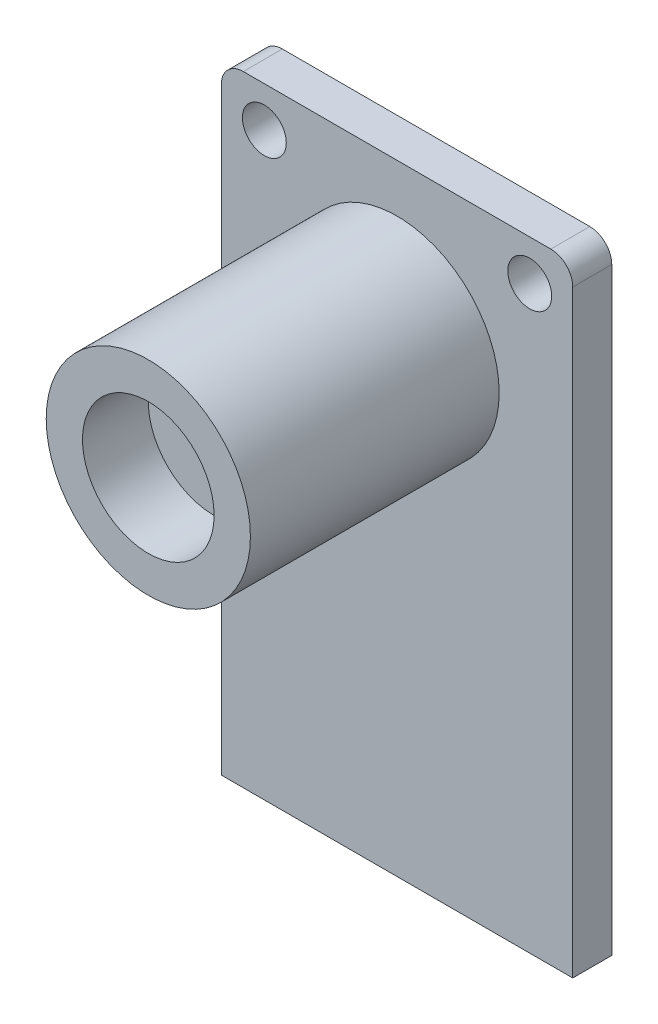
ISO-10303-21;
HEADER;
FILE_DESCRIPTION(('STEP AP214'),'2;1');
FILE_NAME('part.step','',(''),(''),'','','');
FILE_SCHEMA(('AUTOMOTIVE_DESIGN { 1 0 10303 214 1 1 1 1 }'));
ENDSEC;
DATA;
#1=APPLICATION_CONTEXT('core data for automotive mechanical design processes');
#2=APPLICATION_PROTOCOL_DEFINITION('international standard','automotive_design',2000,#1);
#3=PRODUCT_CONTEXT('',#1,'mechanical');
#4=PRODUCT('Part','Part','',(#3));
#5=PRODUCT_RELATED_PRODUCT_CATEGORY('part','',(#4));
#6=PRODUCT_DEFINITION_FORMATION('','',#4);
#7=PRODUCT_DEFINITION_CONTEXT('part definition',#1,'design');
#8=PRODUCT_DEFINITION('design','',#6,#7);
#9=PRODUCT_DEFINITION_SHAPE('','',#8);
#10=(LENGTH_UNIT() NAMED_UNIT(*) SI_UNIT(.MILLI.,.METRE.));
#11=(NAMED_UNIT(*) PLANE_ANGLE_UNIT() SI_UNIT($,.RADIAN.));
#12=(NAMED_UNIT(*) SI_UNIT($,.STERADIAN.) SOLID_ANGLE_UNIT());
#13=UNCERTAINTY_MEASURE_WITH_UNIT(LENGTH_MEASURE(1.E-05),#10,'distance_accuracy_value','');
#14=(GEOMETRIC_REPRESENTATION_CONTEXT(3) GLOBAL_UNCERTAINTY_ASSIGNED_CONTEXT((#13)) GLOBAL_UNIT_ASSIGNED_CONTEXT((#10,
#11,#12)) REPRESENTATION_CONTEXT('',''));
#15=CARTESIAN_POINT('',(0.,0.,0.));
#16=DIRECTION('',(0.,0.,1.));
#17=DIRECTION('',(1.,0.,0.));
#18=AXIS2_PLACEMENT_3D('',#15,#16,#17);
#19=CARTESIAN_POINT('',(8.01,-14.14,1.78));
#20=DIRECTION('',(-1.,0.,0.));
#21=DIRECTION('',(0.,0.,1.));
#22=AXIS2_PLACEMENT_3D('',#19,#20,#21);
#23=PLANE('',#22);
#24=DIRECTION('',(0.,1.,0.));
#25=VECTOR('',#24,1.);
#26=CARTESIAN_POINT('',(8.01,-14.14,0.));
#27=LINE('',#26,#25);
#28=CARTESIAN_POINT('',(8.01,-14.14,0.));
#29=VERTEX_POINT('',#28);
#30=CARTESIAN_POINT('',(8.01,13.14,0.));
#31=VERTEX_POINT('',#30);
#32=EDGE_CURVE('E121',#29,#31,#27,.T.);
#33=ORIENTED_EDGE('',*,*,#32,.T.);
#34=DIRECTION('',(0.,0.,-1.));
#35=VECTOR('',#34,1.);
#36=CARTESIAN_POINT('',(8.01,13.14,1.78));
#37=LINE('',#36,#35);
#38=CARTESIAN_POINT('',(8.01,13.14,1.78));
#39=VERTEX_POINT('',#38);
#40=EDGE_CURVE('E11',#39,#31,#37,.T.);
#41=ORIENTED_EDGE('',*,*,#40,.F.);
#42=DIRECTION('',(0.,1.,0.));
#43=VECTOR('',#42,1.);
#44=CARTESIAN_POINT('',(8.01,-14.14,1.78));
#45=LINE('',#44,#43);
#46=CARTESIAN_POINT('',(8.01,-14.14,1.78));
#47=VERTEX_POINT('',#46);
#48=EDGE_CURVE('E132',#47,#39,#45,.T.);
#49=ORIENTED_EDGE('',*,*,#48,.F.);
#50=DIRECTION('',(0.,0.,-1.));
#51=VECTOR('',#50,1.);
#52=CARTESIAN_POINT('',(8.01,-14.14,1.78));
#53=LINE('',#52,#51);
#54=EDGE_CURVE('E117',#47,#29,#53,.T.);
#55=ORIENTED_EDGE('',*,*,#54,.T.);
#56=EDGE_LOOP('',(#33,#41,#49,#55));
#57=FACE_BOUND('',#56,.T.);
#58=ADVANCED_FACE('F35',(#57),#23,.F.);
#59=CARTESIAN_POINT('',(7.01,13.14,1.78));
#60=DIRECTION('',(0.,0.,-1.));
#61=DIRECTION('',(-1.,0.,0.));
#62=AXIS2_PLACEMENT_3D('',#59,#60,#61);
#63=CYLINDRICAL_SURFACE('',#62,1.);
#64=CARTESIAN_POINT('',(7.01,13.14,0.));
#65=DIRECTION('',(0.,0.,1.));
#66=DIRECTION('',(1.,0.,0.));
#67=AXIS2_PLACEMENT_3D('',#64,#65,#66);
#68=CIRCLE('',#67,1.);
#69=CARTESIAN_POINT('',(7.00999999999999,14.14,0.));
#70=VERTEX_POINT('',#69);
#71=EDGE_CURVE('E124',#31,#70,#68,.T.);
#72=ORIENTED_EDGE('',*,*,#71,.T.);
#73=DIRECTION('',(0.,0.,-1.));
#74=VECTOR('',#73,1.);
#75=CARTESIAN_POINT('',(7.00999999999999,14.14,1.78));
#76=LINE('',#75,#74);
#77=CARTESIAN_POINT('',(7.00999999999999,14.14,1.78));
#78=VERTEX_POINT('',#77);
#79=EDGE_CURVE('E44',#78,#70,#76,.T.);
#80=ORIENTED_EDGE('',*,*,#79,.F.);
#81=CARTESIAN_POINT('',(7.01,13.14,1.78));
#82=DIRECTION('',(0.,0.,1.));
#83=DIRECTION('',(1.,0.,0.));
#84=AXIS2_PLACEMENT_3D('',#81,#82,#83);
#85=CIRCLE('',#84,1.);
#86=EDGE_CURVE('E90',#39,#78,#85,.T.);
#87=ORIENTED_EDGE('',*,*,#86,.F.);
#88=ORIENTED_EDGE('',*,*,#40,.T.);
#89=EDGE_LOOP('',(#72,#80,#87,#88));
#90=FACE_BOUND('',#89,.T.);
#91=ADVANCED_FACE('F165',(#90),#63,.T.);
#92=CARTESIAN_POINT('',(7.00999999999999,14.14,1.78));
#93=DIRECTION('',(0.,-1.,0.));
#94=DIRECTION('',(1.,0.,0.));
#95=AXIS2_PLACEMENT_3D('',#92,#93,#94);
#96=PLANE('',#95);
#97=DIRECTION('',(-1.,0.,0.));
#98=VECTOR('',#97,1.);
#99=CARTESIAN_POINT('',(7.00999999999999,14.14,0.));
#100=LINE('',#99,#98);
#101=CARTESIAN_POINT('',(-7.00999999999999,14.14,0.));
#102=VERTEX_POINT('',#101);
#103=EDGE_CURVE('E127',#70,#102,#100,.T.);
#104=ORIENTED_EDGE('',*,*,#103,.T.);
#105=DIRECTION('',(0.,0.,-1.));
#106=VECTOR('',#105,1.);
#107=CARTESIAN_POINT('',(-7.00999999999999,14.14,1.78));
#108=LINE('',#107,#106);
#109=CARTESIAN_POINT('',(-7.00999999999999,14.14,1.78));
#110=VERTEX_POINT('',#109);
#111=EDGE_CURVE('E112',#110,#102,#108,.T.);
#112=ORIENTED_EDGE('',*,*,#111,.F.);
#113=DIRECTION('',(-1.,0.,0.));
#114=VECTOR('',#113,1.);
#115=CARTESIAN_POINT('',(7.00999999999999,14.14,1.78));
#116=LINE('',#115,#114);
#117=EDGE_CURVE('E103',#78,#110,#116,.T.);
#118=ORIENTED_EDGE('',*,*,#117,.F.);
#119=ORIENTED_EDGE('',*,*,#79,.T.);
#120=EDGE_LOOP('',(#104,#112,#118,#119));
#121=FACE_BOUND('',#120,.T.);
#122=ADVANCED_FACE('F168',(#121),#96,.F.);
#123=CARTESIAN_POINT('',(-7.01,13.14,1.78));
#124=DIRECTION('',(0.,0.,-1.));
#125=DIRECTION('',(-1.,0.,0.));
#126=AXIS2_PLACEMENT_3D('',#123,#124,#125);
#127=CYLINDRICAL_SURFACE('',#126,1.);
#128=CARTESIAN_POINT('',(-7.01,13.14,0.));
#129=DIRECTION('',(0.,0.,1.));
#130=DIRECTION('',(-1.,0.,0.));
#131=AXIS2_PLACEMENT_3D('',#128,#129,#130);
#132=CIRCLE('',#131,1.);
#133=CARTESIAN_POINT('',(-8.01,13.14,0.));
#134=VERTEX_POINT('',#133);
#135=EDGE_CURVE('E111',#102,#134,#132,.T.);
#136=ORIENTED_EDGE('',*,*,#135,.T.);
#137=DIRECTION('',(0.,0.,-1.));
#138=VECTOR('',#137,1.);
#139=CARTESIAN_POINT('',(-8.01,13.14,1.78));
#140=LINE('',#139,#138);
#141=CARTESIAN_POINT('',(-8.01,13.14,1.78));
#142=VERTEX_POINT('',#141);
#143=EDGE_CURVE('E108',#142,#134,#140,.T.);
#144=ORIENTED_EDGE('',*,*,#143,.F.);
#145=CARTESIAN_POINT('',(-7.01,13.14,1.78));
#146=DIRECTION('',(0.,0.,1.));
#147=DIRECTION('',(-1.,0.,0.));
#148=AXIS2_PLACEMENT_3D('',#145,#146,#147);
#149=CIRCLE('',#148,1.);
#150=EDGE_CURVE('E97',#110,#142,#149,.T.);
#151=ORIENTED_EDGE('',*,*,#150,.F.);
#152=ORIENTED_EDGE('',*,*,#111,.T.);
#153=EDGE_LOOP('',(#136,#144,#151,#152));
#154=FACE_BOUND('',#153,.T.);
#155=ADVANCED_FACE('F109',(#154),#127,.T.);
#156=CARTESIAN_POINT('',(-8.01,-14.14,1.78));
#157=DIRECTION('',(1.,0.,0.));
#158=DIRECTION('',(0.,0.,-1.));
#159=AXIS2_PLACEMENT_3D('',#156,#157,#158);
#160=PLANE('',#159);
#161=DIRECTION('',(0.,-1.,0.));
#162=VECTOR('',#161,1.);
#163=CARTESIAN_POINT('',(-8.01,-14.14,0.));
#164=LINE('',#163,#162);
#165=CARTESIAN_POINT('',(-8.01,-14.14,0.));
#166=VERTEX_POINT('',#165);
#167=EDGE_CURVE('E76',#134,#166,#164,.T.);
#168=ORIENTED_EDGE('',*,*,#167,.T.);
#169=DIRECTION('',(0.,0.,-1.));
#170=VECTOR('',#169,1.);
#171=CARTESIAN_POINT('',(-8.01,-14.14,1.78));
#172=LINE('',#171,#170);
#173=CARTESIAN_POINT('',(-8.01,-14.14,1.78));
#174=VERTEX_POINT('',#173);
#175=EDGE_CURVE('E113',#174,#166,#172,.T.);
#176=ORIENTED_EDGE('',*,*,#175,.F.);
#177=DIRECTION('',(0.,-1.,0.));
#178=VECTOR('',#177,1.);
#179=CARTESIAN_POINT('',(-8.01,-14.14,1.78));
#180=LINE('',#179,#178);
#181=EDGE_CURVE('E101',#142,#174,#180,.T.);
#182=ORIENTED_EDGE('',*,*,#181,.F.);
#183=ORIENTED_EDGE('',*,*,#143,.T.);
#184=EDGE_LOOP('',(#168,#176,#182,#183));
#185=FACE_BOUND('',#184,.T.);
#186=ADVANCED_FACE('F115',(#185),#160,.F.);
#187=CARTESIAN_POINT('',(8.01,-14.14,1.78));
#188=DIRECTION('',(0.,1.,0.));
#189=DIRECTION('',(-1.,0.,0.));
#190=AXIS2_PLACEMENT_3D('',#187,#188,#189);
#191=PLANE('',#190);
#192=DIRECTION('',(1.,0.,0.));
#193=VECTOR('',#192,1.);
#194=CARTESIAN_POINT('',(8.01,-14.14,0.));
#195=LINE('',#194,#193);
#196=EDGE_CURVE('E82',#166,#29,#195,.T.);
#197=ORIENTED_EDGE('',*,*,#196,.T.);
#198=ORIENTED_EDGE('',*,*,#54,.F.);
#199=DIRECTION('',(1.,0.,0.));
#200=VECTOR('',#199,1.);
#201=CARTESIAN_POINT('',(8.01,-14.14,1.78));
#202=LINE('',#201,#200);
#203=EDGE_CURVE('E53',#174,#47,#202,.T.);
#204=ORIENTED_EDGE('',*,*,#203,.F.);
#205=ORIENTED_EDGE('',*,*,#175,.T.);
#206=EDGE_LOOP('',(#197,#198,#204,#205));
#207=FACE_BOUND('',#206,.T.);
#208=ADVANCED_FACE('F173',(#207),#191,.F.);
#209=CARTESIAN_POINT('',(7.01,13.14,1.78));
#210=DIRECTION('',(0.,0.,1.));
#211=DIRECTION('',(1.,0.,0.));
#212=AXIS2_PLACEMENT_3D('',#209,#210,#211);
#213=PLANE('',#212);
#214=CARTESIAN_POINT('',(-6.05,12.2998600123924,1.78));
#215=DIRECTION('',(0.,0.,1.));
#216=DIRECTION('',(-1.,0.,0.));
#217=AXIS2_PLACEMENT_3D('',#214,#215,#216);
#218=CIRCLE('',#217,0.999999999999998);
#219=CARTESIAN_POINT('',(-7.05,12.2998600123924,1.78));
#220=VERTEX_POINT('',#219);
#221=EDGE_CURVE('E139',#220,#220,#218,.T.);
#222=ORIENTED_EDGE('',*,*,#221,.F.);
#223=EDGE_LOOP('',(#222));
#224=FACE_BOUND('',#223,.T.);
#225=CARTESIAN_POINT('',(6.05,12.2998600123924,1.78));
#226=DIRECTION('',(0.,0.,1.));
#227=DIRECTION('',(1.,0.,0.));
#228=AXIS2_PLACEMENT_3D('',#225,#226,#227);
#229=CIRCLE('',#228,0.999999999999998);
#230=CARTESIAN_POINT('',(7.05,12.2998600123924,1.78));
#231=VERTEX_POINT('',#230);
#232=EDGE_CURVE('E145',#231,#231,#229,.T.);
#233=ORIENTED_EDGE('',*,*,#232,.F.);
#234=EDGE_LOOP('',(#233));
#235=FACE_BOUND('',#234,.T.);
#236=CARTESIAN_POINT('',(0.,7.285,1.78));
#237=DIRECTION('',(0.,0.,1.));
#238=DIRECTION('',(1.,0.,0.));
#239=AXIS2_PLACEMENT_3D('',#236,#237,#238);
#240=CIRCLE('',#239,4.655);
#241=CARTESIAN_POINT('',(-4.655,7.285,1.78));
#242=VERTEX_POINT('',#241);
#243=EDGE_CURVE('E155',#242,#242,#240,.T.);
#244=ORIENTED_EDGE('',*,*,#243,.F.);
#245=EDGE_LOOP('',(#244));
#246=FACE_BOUND('',#245,.T.);
#247=ORIENTED_EDGE('',*,*,#48,.T.);
#248=ORIENTED_EDGE('',*,*,#86,.T.);
#249=ORIENTED_EDGE('',*,*,#117,.T.);
#250=ORIENTED_EDGE('',*,*,#150,.T.);
#251=ORIENTED_EDGE('',*,*,#181,.T.);
#252=ORIENTED_EDGE('',*,*,#203,.T.);
#253=EDGE_LOOP('',(#247,#248,#249,#250,#251,#252));
#254=FACE_BOUND('',#253,.T.);
#255=ADVANCED_FACE('F99',(#224,#235,#246,#254),#213,.T.);
#256=CARTESIAN_POINT('',(7.01,13.14,0.));
#257=DIRECTION('',(0.,0.,1.));
#258=DIRECTION('',(1.,0.,0.));
#259=AXIS2_PLACEMENT_3D('',#256,#257,#258);
#260=PLANE('',#259);
#261=CARTESIAN_POINT('',(-6.05,12.2998600123924,0.));
#262=DIRECTION('',(0.,0.,1.));
#263=DIRECTION('',(1.,0.,0.));
#264=AXIS2_PLACEMENT_3D('',#261,#262,#263);
#265=CIRCLE('',#264,0.999999999999998);
#266=CARTESIAN_POINT('',(-5.05,12.2998600123924,0.));
#267=VERTEX_POINT('',#266);
#268=EDGE_CURVE('E38',#267,#267,#265,.T.);
#269=ORIENTED_EDGE('',*,*,#268,.T.);
#270=EDGE_LOOP('',(#269));
#271=FACE_BOUND('',#270,.T.);
#272=CARTESIAN_POINT('',(6.05,12.2998600123924,0.));
#273=DIRECTION('',(0.,0.,1.));
#274=DIRECTION('',(1.,0.,0.));
#275=AXIS2_PLACEMENT_3D('',#272,#273,#274);
#276=CIRCLE('',#275,0.999999999999998);
#277=CARTESIAN_POINT('',(7.05,12.2998600123924,0.));
#278=VERTEX_POINT('',#277);
#279=EDGE_CURVE('E137',#278,#278,#276,.T.);
#280=ORIENTED_EDGE('',*,*,#279,.T.);
#281=EDGE_LOOP('',(#280));
#282=FACE_BOUND('',#281,.T.);
#283=ORIENTED_EDGE('',*,*,#32,.F.);
#284=ORIENTED_EDGE('',*,*,#196,.F.);
#285=ORIENTED_EDGE('',*,*,#167,.F.);
#286=ORIENTED_EDGE('',*,*,#135,.F.);
#287=ORIENTED_EDGE('',*,*,#103,.F.);
#288=ORIENTED_EDGE('',*,*,#71,.F.);
#289=EDGE_LOOP('',(#283,#284,#285,#286,#287,#288));
#290=FACE_BOUND('',#289,.T.);
#291=ADVANCED_FACE('F171',(#271,#282,#290),#260,.F.);
#292=CARTESIAN_POINT('',(0.,7.285,13.12));
#293=DIRECTION('',(0.,0.,-1.));
#294=DIRECTION('',(-1.,0.,0.));
#295=AXIS2_PLACEMENT_3D('',#292,#293,#294);
#296=CYLINDRICAL_SURFACE('',#295,4.655);
#297=CARTESIAN_POINT('',(0.,7.285,13.12));
#298=DIRECTION('',(0.,0.,1.));
#299=DIRECTION('',(1.,0.,0.));
#300=AXIS2_PLACEMENT_3D('',#297,#298,#299);
#301=CIRCLE('',#300,4.655);
#302=CARTESIAN_POINT('',(-4.655,7.285,13.12));
#303=VERTEX_POINT('',#302);
#304=EDGE_CURVE('E125',#303,#303,#301,.T.);
#305=CARTESIAN_POINT('',(-4.655,7.285,13.12));
#306=CARTESIAN_POINT('',(-4.655,7.285,13.001875));
#307=CARTESIAN_POINT('',(-4.655,7.285,12.88375));
#308=CARTESIAN_POINT('',(-4.655,7.285,12.6475));
#309=CARTESIAN_POINT('',(-4.655,7.285,12.529375));
#310=CARTESIAN_POINT('',(-4.655,7.285,12.293125));
#311=CARTESIAN_POINT('',(-4.655,7.285,12.175));
#312=CARTESIAN_POINT('',(-4.655,7.285,11.93875));
#313=CARTESIAN_POINT('',(-4.655,7.285,11.820625));
#314=CARTESIAN_POINT('',(-4.655,7.285,11.584375));
#315=CARTESIAN_POINT('',(-4.655,7.285,11.46625));
#316=CARTESIAN_POINT('',(-4.655,7.285,11.23));
#317=CARTESIAN_POINT('',(-4.655,7.285,11.111875));
#318=CARTESIAN_POINT('',(-4.655,7.285,10.875625));
#319=CARTESIAN_POINT('',(-4.655,7.285,10.7575));
#320=CARTESIAN_POINT('',(-4.655,7.285,10.52125));
#321=CARTESIAN_POINT('',(-4.655,7.285,10.403125));
#322=CARTESIAN_POINT('',(-4.655,7.285,10.166875));
#323=CARTESIAN_POINT('',(-4.655,7.285,10.04875));
#324=CARTESIAN_POINT('',(-4.655,7.285,9.8125));
#325=CARTESIAN_POINT('',(-4.655,7.285,9.694375));
#326=CARTESIAN_POINT('',(-4.655,7.285,9.458125));
#327=CARTESIAN_POINT('',(-4.655,7.285,9.34));
#328=CARTESIAN_POINT('',(-4.655,7.285,9.10375));
#329=CARTESIAN_POINT('',(-4.655,7.285,8.985625));
#330=CARTESIAN_POINT('',(-4.655,7.285,8.749375));
#331=CARTESIAN_POINT('',(-4.655,7.285,8.63125));
#332=CARTESIAN_POINT('',(-4.655,7.285,8.395));
#333=CARTESIAN_POINT('',(-4.655,7.285,8.276875));
#334=CARTESIAN_POINT('',(-4.655,7.285,8.040625));
#335=CARTESIAN_POINT('',(-4.655,7.285,7.9225));
#336=CARTESIAN_POINT('',(-4.655,7.285,7.68625));
#337=CARTESIAN_POINT('',(-4.655,7.285,7.568125));
#338=CARTESIAN_POINT('',(-4.655,7.285,7.331875));
#339=CARTESIAN_POINT('',(-4.655,7.285,7.21375));
#340=CARTESIAN_POINT('',(-4.655,7.285,6.9775));
#341=CARTESIAN_POINT('',(-4.655,7.285,6.859375));
#342=CARTESIAN_POINT('',(-4.655,7.285,6.623125));
#343=CARTESIAN_POINT('',(-4.655,7.285,6.505));
#344=CARTESIAN_POINT('',(-4.655,7.285,6.26875));
#345=CARTESIAN_POINT('',(-4.655,7.285,6.150625));
#346=CARTESIAN_POINT('',(-4.655,7.285,5.914375));
#347=CARTESIAN_POINT('',(-4.655,7.285,5.79625));
#348=CARTESIAN_POINT('',(-4.655,7.285,5.56));
#349=CARTESIAN_POINT('',(-4.655,7.285,5.441875));
#350=CARTESIAN_POINT('',(-4.655,7.285,5.205625));
#351=CARTESIAN_POINT('',(-4.655,7.285,5.0875));
#352=CARTESIAN_POINT('',(-4.655,7.285,4.85125));
#353=CARTESIAN_POINT('',(-4.655,7.285,4.733125));
#354=CARTESIAN_POINT('',(-4.655,7.285,4.496875));
#355=CARTESIAN_POINT('',(-4.655,7.285,4.37875));
#356=CARTESIAN_POINT('',(-4.655,7.285,4.1425));
#357=CARTESIAN_POINT('',(-4.655,7.285,4.024375));
#358=CARTESIAN_POINT('',(-4.655,7.285,3.788125));
#359=CARTESIAN_POINT('',(-4.655,7.285,3.67));
#360=CARTESIAN_POINT('',(-4.655,7.285,3.43375));
#361=CARTESIAN_POINT('',(-4.655,7.285,3.315625));
#362=CARTESIAN_POINT('',(-4.655,7.285,3.079375));
#363=CARTESIAN_POINT('',(-4.655,7.285,2.96125));
#364=CARTESIAN_POINT('',(-4.655,7.285,2.725));
#365=CARTESIAN_POINT('',(-4.655,7.285,2.606875));
#366=CARTESIAN_POINT('',(-4.655,7.285,2.370625));
#367=CARTESIAN_POINT('',(-4.655,7.285,2.2525));
#368=CARTESIAN_POINT('',(-4.655,7.285,2.01625));
#369=CARTESIAN_POINT('',(-4.655,7.285,1.898125));
#370=CARTESIAN_POINT('',(-4.655,7.285,1.78));
#371=B_SPLINE_CURVE_WITH_KNOTS('',3,(#305,#306,#307,#308,#309,#310,#311,#312,#313,#314,#315,
#316,#317,#318,#319,#320,#321,#322,#323,#324,#325,#326,#327,#328,#329,#330,#331,#332,#333,#334,
#335,#336,#337,#338,#339,#340,#341,#342,#343,#344,#345,#346,#347,#348,#349,#350,#351,#352,#353,
#354,#355,#356,#357,#358,#359,#360,#361,#362,#363,#364,#365,#366,#367,#368,#369,#370),
.UNSPECIFIED.,.F.,.F.,(4,2,2,2,2,2,2,2,2,2,2,2,2,2,2,2,2,2,2,2,2,2,2,2,2,2,2,2,2,2,2,2,4),(0.,
0.354375000000001,0.708750000000001,1.063125,1.4175,1.771875,2.12625,2.480625,2.835,3.189375,
3.54375,3.898125,4.2525,4.606875,4.96125,5.315625,5.67,6.024375,6.37875,6.733125,7.0875,
7.441875,7.79625,8.150625,8.505,8.859375,9.21375,9.568125,9.9225,10.276875,10.63125,10.985625,
11.34),.UNSPECIFIED.);
#372=EDGE_CURVE('BSEAM212',#303,#242,#371,.T.);
#373=ORIENTED_EDGE('',*,*,#304,.F.);
#374=ORIENTED_EDGE('',*,*,#243,.T.);
#375=ORIENTED_EDGE('',*,*,#372,.T.);
#376=ORIENTED_EDGE('',*,*,#372,.F.);
#377=EDGE_LOOP('',(#373,#375,#374,#376));
#378=FACE_BOUND('',#377,.T.);
#379=ADVANCED_FACE('F212',(#378),#296,.T.);
#380=CARTESIAN_POINT('',(0.,7.285,13.12));
#381=DIRECTION('',(0.,0.,1.));
#382=DIRECTION('',(1.,0.,0.));
#383=AXIS2_PLACEMENT_3D('',#380,#381,#382);
#384=PLANE('',#383);
#385=CARTESIAN_POINT('',(0.,7.285,13.12));
#386=DIRECTION('',(0.,0.,1.));
#387=DIRECTION('',(1.,0.,0.));
#388=AXIS2_PLACEMENT_3D('',#385,#386,#387);
#389=CIRCLE('',#388,3.);
#390=CARTESIAN_POINT('',(3.,7.285,13.12));
#391=VERTEX_POINT('',#390);
#392=EDGE_CURVE('E143',#391,#391,#389,.T.);
#393=ORIENTED_EDGE('',*,*,#392,.F.);
#394=EDGE_LOOP('',(#393));
#395=FACE_BOUND('',#394,.T.);
#396=ORIENTED_EDGE('',*,*,#304,.T.);
#397=EDGE_LOOP('',(#396));
#398=FACE_BOUND('',#397,.T.);
#399=ADVANCED_FACE('F218',(#395,#398),#384,.T.);
#400=CARTESIAN_POINT('',(0.,7.285,10.12));
#401=DIRECTION('',(0.,0.,1.));
#402=DIRECTION('',(1.,0.,0.));
#403=AXIS2_PLACEMENT_3D('',#400,#401,#402);
#404=CYLINDRICAL_SURFACE('',#403,3.);
#405=CARTESIAN_POINT('',(0.,7.285,10.12));
#406=DIRECTION('',(0.,0.,1.));
#407=DIRECTION('',(1.,0.,0.));
#408=AXIS2_PLACEMENT_3D('',#405,#406,#407);
#409=CIRCLE('',#408,3.);
#410=CARTESIAN_POINT('',(3.,7.285,10.12));
#411=VERTEX_POINT('',#410);
#412=EDGE_CURVE('E152',#411,#411,#409,.T.);
#413=ORIENTED_EDGE('',*,*,#412,.F.);
#414=EDGE_LOOP('',(#413));
#415=FACE_BOUND('',#414,.T.);
#416=ORIENTED_EDGE('',*,*,#392,.T.);
#417=EDGE_LOOP('',(#416));
#418=FACE_BOUND('',#417,.T.);
#419=ADVANCED_FACE('F231',(#415,#418),#404,.F.);
#420=CARTESIAN_POINT('',(0.,7.285,10.12));
#421=DIRECTION('',(0.,0.,1.));
#422=DIRECTION('',(1.,0.,0.));
#423=AXIS2_PLACEMENT_3D('',#420,#421,#422);
#424=PLANE('',#423);
#425=ORIENTED_EDGE('',*,*,#412,.T.);
#426=EDGE_LOOP('',(#425));
#427=FACE_BOUND('',#426,.T.);
#428=ADVANCED_FACE('F241',(#427),#424,.T.);
#429=CARTESIAN_POINT('',(6.05,12.2998600123924,-1.22));
#430=DIRECTION('',(0.,0.,1.));
#431=DIRECTION('',(1.,0.,0.));
#432=AXIS2_PLACEMENT_3D('',#429,#430,#431);
#433=CYLINDRICAL_SURFACE('',#432,0.999999999999998);
#434=ORIENTED_EDGE('',*,*,#232,.T.);
#435=EDGE_LOOP('',(#434));
#436=FACE_BOUND('',#435,.T.);
#437=ORIENTED_EDGE('',*,*,#279,.F.);
#438=EDGE_LOOP('',(#437));
#439=FACE_BOUND('',#438,.T.);
#440=ADVANCED_FACE('F251',(#436,#439),#433,.F.);
#441=CARTESIAN_POINT('',(-6.05,12.2998600123924,-1.22));
#442=DIRECTION('',(0.,0.,1.));
#443=DIRECTION('',(1.,0.,0.));
#444=AXIS2_PLACEMENT_3D('',#441,#442,#443);
#445=CYLINDRICAL_SURFACE('',#444,0.999999999999998);
#446=ORIENTED_EDGE('',*,*,#221,.T.);
#447=EDGE_LOOP('',(#446));
#448=FACE_BOUND('',#447,.T.);
#449=ORIENTED_EDGE('',*,*,#268,.F.);
#450=EDGE_LOOP('',(#449));
#451=FACE_BOUND('',#450,.T.);
#452=ADVANCED_FACE('F273',(#448,#451),#445,.F.);
#453=CLOSED_SHELL('',(#58,#91,#122,#155,#186,#208,#255,#291,#379,#399,#419,#428,#440,#452));
#454=MANIFOLD_SOLID_BREP('B2',#453);
#455=ADVANCED_BREP_SHAPE_REPRESENTATION('',(#18,#454),#14);
#456=SHAPE_DEFINITION_REPRESENTATION(#9,#455);
ENDSEC;
END-ISO-10303-21;
